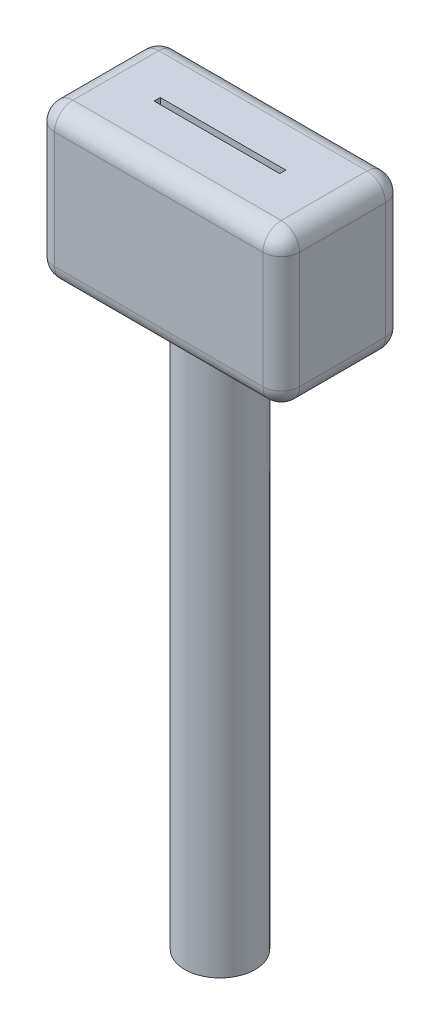
ISO-10303-21;
HEADER;
FILE_DESCRIPTION(('STEP AP214'),'2;1');
FILE_NAME('part.step','',(''),(''),'','','');
FILE_SCHEMA(('AUTOMOTIVE_DESIGN { 1 0 10303 214 1 1 1 1 }'));
ENDSEC;
DATA;
#1=APPLICATION_CONTEXT('core data for automotive mechanical design processes');
#2=APPLICATION_PROTOCOL_DEFINITION('international standard','automotive_design',2000,#1);
#3=PRODUCT_CONTEXT('',#1,'mechanical');
#4=PRODUCT('Part','Part','',(#3));
#5=PRODUCT_RELATED_PRODUCT_CATEGORY('part','',(#4));
#6=PRODUCT_DEFINITION_FORMATION('','',#4);
#7=PRODUCT_DEFINITION_CONTEXT('part definition',#1,'design');
#8=PRODUCT_DEFINITION('design','',#6,#7);
#9=PRODUCT_DEFINITION_SHAPE('','',#8);
#10=(LENGTH_UNIT() NAMED_UNIT(*) SI_UNIT(.MILLI.,.METRE.));
#11=(NAMED_UNIT(*) PLANE_ANGLE_UNIT() SI_UNIT($,.RADIAN.));
#12=(NAMED_UNIT(*) SI_UNIT($,.STERADIAN.) SOLID_ANGLE_UNIT());
#13=UNCERTAINTY_MEASURE_WITH_UNIT(LENGTH_MEASURE(1.E-05),#10,'distance_accuracy_value','');
#14=(GEOMETRIC_REPRESENTATION_CONTEXT(3) GLOBAL_UNCERTAINTY_ASSIGNED_CONTEXT((#13)) GLOBAL_UNIT_ASSIGNED_CONTEXT((#10,
#11,#12)) REPRESENTATION_CONTEXT('',''));
#15=CARTESIAN_POINT('',(0.,0.,0.));
#16=DIRECTION('',(0.,0.,1.));
#17=DIRECTION('',(1.,0.,0.));
#18=AXIS2_PLACEMENT_3D('',#15,#16,#17);
#19=CARTESIAN_POINT('',(0.,90.,0.));
#20=DIRECTION('',(0.,-1.,0.));
#21=DIRECTION('',(0.,0.,-1.));
#22=AXIS2_PLACEMENT_3D('',#19,#20,#21);
#23=CYLINDRICAL_SURFACE('',#22,5.75);
#24=CARTESIAN_POINT('',(0.,90.,0.));
#25=DIRECTION('',(0.,1.,0.));
#26=DIRECTION('',(0.,0.,1.));
#27=AXIS2_PLACEMENT_3D('',#24,#25,#26);
#28=CIRCLE('',#27,5.75);
#29=CARTESIAN_POINT('',(0.,90.,-5.75));
#30=VERTEX_POINT('',#29);
#31=EDGE_CURVE('E214',#30,#30,#28,.T.);
#32=CARTESIAN_POINT('',(0.,0.,0.));
#33=DIRECTION('',(0.,1.,0.));
#34=DIRECTION('',(0.,0.,1.));
#35=AXIS2_PLACEMENT_3D('',#32,#33,#34);
#36=CIRCLE('',#35,5.75);
#37=CARTESIAN_POINT('',(0.,0.,-5.75));
#38=VERTEX_POINT('',#37);
#39=EDGE_CURVE('E208',#38,#38,#36,.T.);
#40=CARTESIAN_POINT('',(0.,90.,-5.75));
#41=CARTESIAN_POINT('',(0.,89.0625,-5.75));
#42=CARTESIAN_POINT('',(0.,88.125,-5.75));
#43=CARTESIAN_POINT('',(0.,86.25,-5.75));
#44=CARTESIAN_POINT('',(0.,85.3125,-5.75));
#45=CARTESIAN_POINT('',(0.,83.4375,-5.75));
#46=CARTESIAN_POINT('',(0.,82.5,-5.75));
#47=CARTESIAN_POINT('',(0.,80.625,-5.75));
#48=CARTESIAN_POINT('',(0.,79.6875,-5.75));
#49=CARTESIAN_POINT('',(0.,77.8125,-5.75));
#50=CARTESIAN_POINT('',(0.,76.875,-5.75));
#51=CARTESIAN_POINT('',(0.,75.,-5.75));
#52=CARTESIAN_POINT('',(0.,74.0625,-5.75));
#53=CARTESIAN_POINT('',(0.,72.1875,-5.75));
#54=CARTESIAN_POINT('',(0.,71.25,-5.75));
#55=CARTESIAN_POINT('',(0.,69.375,-5.75));
#56=CARTESIAN_POINT('',(0.,68.4375,-5.75));
#57=CARTESIAN_POINT('',(0.,66.5625,-5.75));
#58=CARTESIAN_POINT('',(0.,65.625,-5.75));
#59=CARTESIAN_POINT('',(0.,63.75,-5.75));
#60=CARTESIAN_POINT('',(0.,62.8125,-5.75));
#61=CARTESIAN_POINT('',(0.,60.9375,-5.75));
#62=CARTESIAN_POINT('',(0.,60.,-5.75));
#63=CARTESIAN_POINT('',(0.,58.125,-5.75));
#64=CARTESIAN_POINT('',(0.,57.1875,-5.75));
#65=CARTESIAN_POINT('',(0.,55.3125,-5.75));
#66=CARTESIAN_POINT('',(0.,54.375,-5.75));
#67=CARTESIAN_POINT('',(0.,52.5,-5.75));
#68=CARTESIAN_POINT('',(0.,51.5625,-5.75));
#69=CARTESIAN_POINT('',(0.,49.6875,-5.75));
#70=CARTESIAN_POINT('',(0.,48.75,-5.75));
#71=CARTESIAN_POINT('',(0.,46.875,-5.75));
#72=CARTESIAN_POINT('',(0.,45.9375,-5.75));
#73=CARTESIAN_POINT('',(0.,44.0625,-5.75));
#74=CARTESIAN_POINT('',(0.,43.125,-5.75));
#75=CARTESIAN_POINT('',(0.,41.25,-5.75));
#76=CARTESIAN_POINT('',(0.,40.3125,-5.75));
#77=CARTESIAN_POINT('',(0.,38.4375,-5.75));
#78=CARTESIAN_POINT('',(0.,37.5,-5.75));
#79=CARTESIAN_POINT('',(0.,35.625,-5.75));
#80=CARTESIAN_POINT('',(0.,34.6875,-5.75));
#81=CARTESIAN_POINT('',(0.,32.8125,-5.75));
#82=CARTESIAN_POINT('',(0.,31.875,-5.75));
#83=CARTESIAN_POINT('',(0.,30.,-5.75));
#84=CARTESIAN_POINT('',(0.,29.0625,-5.75));
#85=CARTESIAN_POINT('',(0.,27.1875,-5.75));
#86=CARTESIAN_POINT('',(0.,26.25,-5.75));
#87=CARTESIAN_POINT('',(0.,24.375,-5.75));
#88=CARTESIAN_POINT('',(0.,23.4375,-5.75));
#89=CARTESIAN_POINT('',(0.,21.5625,-5.75));
#90=CARTESIAN_POINT('',(0.,20.625,-5.75));
#91=CARTESIAN_POINT('',(0.,18.75,-5.75));
#92=CARTESIAN_POINT('',(0.,17.8125,-5.75));
#93=CARTESIAN_POINT('',(0.,15.9375,-5.75));
#94=CARTESIAN_POINT('',(0.,15.,-5.75));
#95=CARTESIAN_POINT('',(0.,13.125,-5.75));
#96=CARTESIAN_POINT('',(0.,12.1875,-5.75));
#97=CARTESIAN_POINT('',(0.,10.3125,-5.75));
#98=CARTESIAN_POINT('',(0.,9.37499999999999,-5.75));
#99=CARTESIAN_POINT('',(0.,7.49999999999999,-5.75));
#100=CARTESIAN_POINT('',(0.,6.56249999999999,-5.75));
#101=CARTESIAN_POINT('',(0.,4.68749999999999,-5.75));
#102=CARTESIAN_POINT('',(0.,3.74999999999998,-5.75));
#103=CARTESIAN_POINT('',(0.,1.87499999999998,-5.75));
#104=CARTESIAN_POINT('',(0.,0.937499999999986,-5.75));
#105=CARTESIAN_POINT('',(0.,0.,-5.75));
#106=B_SPLINE_CURVE_WITH_KNOTS('',3,(#40,#41,#42,#43,#44,#45,#46,#47,#48,#49,#50,#51,#52,#53,
#54,#55,#56,#57,#58,#59,#60,#61,#62,#63,#64,#65,#66,#67,#68,#69,#70,#71,#72,#73,#74,#75,#76,#77,
#78,#79,#80,#81,#82,#83,#84,#85,#86,#87,#88,#89,#90,#91,#92,#93,#94,#95,#96,#97,#98,#99,#100,
#101,#102,#103,#104,#105),.UNSPECIFIED.,.F.,.F.,(4,2,2,2,2,2,2,2,2,2,2,2,2,2,2,2,2,2,2,2,2,2,2,
2,2,2,2,2,2,2,2,2,4),(0.,2.81250000000001,5.62500000000001,8.43750000000001,11.25,14.0625,
16.875,19.6875,22.5,25.3125,28.125,30.9375,33.75,36.5625,39.375,42.1875,45.,47.8125,50.625,
53.4375,56.25,59.0625,61.875,64.6875,67.5,70.3125,73.125,75.9375,78.75,81.5625,84.375,87.1875,
90.),.UNSPECIFIED.);
#107=EDGE_CURVE('BSEAM45',#30,#38,#106,.T.);
#108=ORIENTED_EDGE('',*,*,#31,.F.);
#109=ORIENTED_EDGE('',*,*,#39,.T.);
#110=ORIENTED_EDGE('',*,*,#107,.T.);
#111=ORIENTED_EDGE('',*,*,#107,.F.);
#112=EDGE_LOOP('',(#108,#110,#109,#111));
#113=FACE_BOUND('',#112,.T.);
#114=ADVANCED_FACE('F45',(#113),#23,.T.);
#115=CARTESIAN_POINT('',(0.,0.,0.));
#116=DIRECTION('',(0.,1.,0.));
#117=DIRECTION('',(0.,0.,1.));
#118=AXIS2_PLACEMENT_3D('',#115,#116,#117);
#119=PLANE('',#118);
#120=ORIENTED_EDGE('',*,*,#39,.F.);
#121=EDGE_LOOP('',(#120));
#122=FACE_BOUND('',#121,.T.);
#123=ADVANCED_FACE('F476',(#122),#119,.F.);
#124=CARTESIAN_POINT('',(20.,115.,10.));
#125=DIRECTION('',(-1.,0.,0.));
#126=DIRECTION('',(0.,0.,1.));
#127=AXIS2_PLACEMENT_3D('',#124,#125,#126);
#128=PLANE('',#127);
#129=DIRECTION('',(0.,0.,-1.));
#130=VECTOR('',#129,1.);
#131=CARTESIAN_POINT('',(20.,93.,-10.));
#132=LINE('',#131,#130);
#133=CARTESIAN_POINT('',(20.,93.,7.));
#134=VERTEX_POINT('',#133);
#135=CARTESIAN_POINT('',(20.,93.,-7.));
#136=VERTEX_POINT('',#135);
#137=EDGE_CURVE('E263',#134,#136,#132,.T.);
#138=ORIENTED_EDGE('',*,*,#137,.T.);
#139=DIRECTION('',(0.,-1.,0.));
#140=VECTOR('',#139,1.);
#141=CARTESIAN_POINT('',(20.,115.,-7.));
#142=LINE('',#141,#140);
#143=CARTESIAN_POINT('',(20.,112.,-7.));
#144=VERTEX_POINT('',#143);
#145=EDGE_CURVE('E270',#136,#144,#142,.F.);
#146=ORIENTED_EDGE('',*,*,#145,.T.);
#147=DIRECTION('',(0.,0.,-1.));
#148=VECTOR('',#147,1.);
#149=CARTESIAN_POINT('',(20.,112.,10.));
#150=LINE('',#149,#148);
#151=CARTESIAN_POINT('',(20.,112.,7.));
#152=VERTEX_POINT('',#151);
#153=EDGE_CURVE('E266',#144,#152,#150,.F.);
#154=ORIENTED_EDGE('',*,*,#153,.T.);
#155=DIRECTION('',(0.,-1.,0.));
#156=VECTOR('',#155,1.);
#157=CARTESIAN_POINT('',(20.,115.,7.));
#158=LINE('',#157,#156);
#159=EDGE_CURVE('E260',#152,#134,#158,.T.);
#160=ORIENTED_EDGE('',*,*,#159,.T.);
#161=EDGE_LOOP('',(#138,#146,#154,#160));
#162=FACE_BOUND('',#161,.T.);
#163=ADVANCED_FACE('F428',(#162),#128,.F.);
#164=CARTESIAN_POINT('',(-20.,115.,-10.));
#165=DIRECTION('',(0.,0.,1.));
#166=DIRECTION('',(1.,0.,0.));
#167=AXIS2_PLACEMENT_3D('',#164,#165,#166);
#168=PLANE('',#167);
#169=DIRECTION('',(-1.,0.,0.));
#170=VECTOR('',#169,1.);
#171=CARTESIAN_POINT('',(-20.,112.,-10.));
#172=LINE('',#171,#170);
#173=CARTESIAN_POINT('',(-17.,112.,-10.));
#174=VERTEX_POINT('',#173);
#175=CARTESIAN_POINT('',(17.,112.,-10.));
#176=VERTEX_POINT('',#175);
#177=EDGE_CURVE('E279',#174,#176,#172,.F.);
#178=ORIENTED_EDGE('',*,*,#177,.T.);
#179=DIRECTION('',(0.,-1.,0.));
#180=VECTOR('',#179,1.);
#181=CARTESIAN_POINT('',(17.,115.,-10.));
#182=LINE('',#181,#180);
#183=CARTESIAN_POINT('',(17.,93.,-10.));
#184=VERTEX_POINT('',#183);
#185=EDGE_CURVE('E282',#176,#184,#182,.T.);
#186=ORIENTED_EDGE('',*,*,#185,.T.);
#187=DIRECTION('',(-1.,0.,0.));
#188=VECTOR('',#187,1.);
#189=CARTESIAN_POINT('',(-20.,93.,-10.));
#190=LINE('',#189,#188);
#191=CARTESIAN_POINT('',(-17.,93.,-10.));
#192=VERTEX_POINT('',#191);
#193=EDGE_CURVE('E273',#184,#192,#190,.T.);
#194=ORIENTED_EDGE('',*,*,#193,.T.);
#195=DIRECTION('',(0.,-1.,0.));
#196=VECTOR('',#195,1.);
#197=CARTESIAN_POINT('',(-17.,115.,-10.));
#198=LINE('',#197,#196);
#199=EDGE_CURVE('E276',#192,#174,#198,.F.);
#200=ORIENTED_EDGE('',*,*,#199,.T.);
#201=EDGE_LOOP('',(#178,#186,#194,#200));
#202=FACE_BOUND('',#201,.T.);
#203=ADVANCED_FACE('F399',(#202),#168,.F.);
#204=CARTESIAN_POINT('',(-20.,115.,10.));
#205=DIRECTION('',(1.,0.,0.));
#206=DIRECTION('',(0.,0.,-1.));
#207=AXIS2_PLACEMENT_3D('',#204,#205,#206);
#208=PLANE('',#207);
#209=DIRECTION('',(0.,0.,1.));
#210=VECTOR('',#209,1.);
#211=CARTESIAN_POINT('',(-20.,112.,10.));
#212=LINE('',#211,#210);
#213=CARTESIAN_POINT('',(-20.,112.,7.));
#214=VERTEX_POINT('',#213);
#215=CARTESIAN_POINT('',(-20.,112.,-7.));
#216=VERTEX_POINT('',#215);
#217=EDGE_CURVE('E240',#214,#216,#212,.F.);
#218=ORIENTED_EDGE('',*,*,#217,.T.);
#219=DIRECTION('',(0.,-1.,0.));
#220=VECTOR('',#219,1.);
#221=CARTESIAN_POINT('',(-20.,115.,-7.));
#222=LINE('',#221,#220);
#223=CARTESIAN_POINT('',(-20.,93.,-7.));
#224=VERTEX_POINT('',#223);
#225=EDGE_CURVE('E244',#216,#224,#222,.T.);
#226=ORIENTED_EDGE('',*,*,#225,.T.);
#227=DIRECTION('',(0.,0.,1.));
#228=VECTOR('',#227,1.);
#229=CARTESIAN_POINT('',(-20.,93.,10.));
#230=LINE('',#229,#228);
#231=CARTESIAN_POINT('',(-20.,93.,7.));
#232=VERTEX_POINT('',#231);
#233=EDGE_CURVE('E237',#224,#232,#230,.T.);
#234=ORIENTED_EDGE('',*,*,#233,.T.);
#235=DIRECTION('',(0.,-1.,0.));
#236=VECTOR('',#235,1.);
#237=CARTESIAN_POINT('',(-20.,115.,7.));
#238=LINE('',#237,#236);
#239=EDGE_CURVE('E234',#232,#214,#238,.F.);
#240=ORIENTED_EDGE('',*,*,#239,.T.);
#241=EDGE_LOOP('',(#218,#226,#234,#240));
#242=FACE_BOUND('',#241,.T.);
#243=ADVANCED_FACE('F694',(#242),#208,.F.);
#244=CARTESIAN_POINT('',(-20.,115.,10.));
#245=DIRECTION('',(0.,0.,-1.));
#246=DIRECTION('',(-1.,0.,0.));
#247=AXIS2_PLACEMENT_3D('',#244,#245,#246);
#248=PLANE('',#247);
#249=DIRECTION('',(1.,0.,0.));
#250=VECTOR('',#249,1.);
#251=CARTESIAN_POINT('',(-20.,112.,10.));
#252=LINE('',#251,#250);
#253=CARTESIAN_POINT('',(17.,112.,10.));
#254=VERTEX_POINT('',#253);
#255=CARTESIAN_POINT('',(-17.,112.,10.));
#256=VERTEX_POINT('',#255);
#257=EDGE_CURVE('E55',#254,#256,#252,.F.);
#258=ORIENTED_EDGE('',*,*,#257,.T.);
#259=DIRECTION('',(0.,-1.,0.));
#260=VECTOR('',#259,1.);
#261=CARTESIAN_POINT('',(-17.,115.,10.));
#262=LINE('',#261,#260);
#263=CARTESIAN_POINT('',(-17.,93.,10.));
#264=VERTEX_POINT('',#263);
#265=EDGE_CURVE('E11',#256,#264,#262,.T.);
#266=ORIENTED_EDGE('',*,*,#265,.T.);
#267=DIRECTION('',(1.,0.,0.));
#268=VECTOR('',#267,1.);
#269=CARTESIAN_POINT('',(20.,93.,10.));
#270=LINE('',#269,#268);
#271=CARTESIAN_POINT('',(17.,93.,10.));
#272=VERTEX_POINT('',#271);
#273=EDGE_CURVE('E286',#264,#272,#270,.T.);
#274=ORIENTED_EDGE('',*,*,#273,.T.);
#275=DIRECTION('',(0.,-1.,0.));
#276=VECTOR('',#275,1.);
#277=CARTESIAN_POINT('',(17.,115.,10.));
#278=LINE('',#277,#276);
#279=EDGE_CURVE('E66',#272,#254,#278,.F.);
#280=ORIENTED_EDGE('',*,*,#279,.T.);
#281=EDGE_LOOP('',(#258,#266,#274,#280));
#282=FACE_BOUND('',#281,.T.);
#283=ADVANCED_FACE('F686',(#282),#248,.F.);
#284=CARTESIAN_POINT('',(0.,115.,0.));
#285=DIRECTION('',(0.,-1.,0.));
#286=DIRECTION('',(0.,0.,-1.));
#287=AXIS2_PLACEMENT_3D('',#284,#285,#286);
#288=PLANE('',#287);
#289=DIRECTION('',(0.,0.,-1.));
#290=VECTOR('',#289,1.);
#291=CARTESIAN_POINT('',(17.,115.,0.));
#292=LINE('',#291,#290);
#293=CARTESIAN_POINT('',(17.,115.,7.));
#294=VERTEX_POINT('',#293);
#295=CARTESIAN_POINT('',(17.,115.,-7.));
#296=VERTEX_POINT('',#295);
#297=EDGE_CURVE('E224',#294,#296,#292,.T.);
#298=ORIENTED_EDGE('',*,*,#297,.T.);
#299=DIRECTION('',(-1.,0.,0.));
#300=VECTOR('',#299,1.);
#301=CARTESIAN_POINT('',(0.,115.,-7.));
#302=LINE('',#301,#300);
#303=CARTESIAN_POINT('',(-17.,115.,-7.));
#304=VERTEX_POINT('',#303);
#305=EDGE_CURVE('E231',#296,#304,#302,.T.);
#306=ORIENTED_EDGE('',*,*,#305,.T.);
#307=DIRECTION('',(0.,0.,1.));
#308=VECTOR('',#307,1.);
#309=CARTESIAN_POINT('',(-17.,115.,0.));
#310=LINE('',#309,#308);
#311=CARTESIAN_POINT('',(-17.,115.,7.));
#312=VERTEX_POINT('',#311);
#313=EDGE_CURVE('E227',#304,#312,#310,.T.);
#314=ORIENTED_EDGE('',*,*,#313,.T.);
#315=DIRECTION('',(1.,0.,0.));
#316=VECTOR('',#315,1.);
#317=CARTESIAN_POINT('',(0.,115.,7.));
#318=LINE('',#317,#316);
#319=EDGE_CURVE('E218',#312,#294,#318,.T.);
#320=ORIENTED_EDGE('',*,*,#319,.T.);
#321=EDGE_LOOP('',(#298,#306,#314,#320));
#322=FACE_BOUND('',#321,.T.);
#323=DIRECTION('',(-1.,0.,0.));
#324=VECTOR('',#323,1.);
#325=CARTESIAN_POINT('',(-10.25,115.,-0.5));
#326=LINE('',#325,#324);
#327=CARTESIAN_POINT('',(10.25,115.,-0.5));
#328=VERTEX_POINT('',#327);
#329=CARTESIAN_POINT('',(-10.25,115.,-0.5));
#330=VERTEX_POINT('',#329);
#331=EDGE_CURVE('E199',#328,#330,#326,.T.);
#332=ORIENTED_EDGE('',*,*,#331,.F.);
#333=DIRECTION('',(0.,0.,-1.));
#334=VECTOR('',#333,1.);
#335=CARTESIAN_POINT('',(10.25,115.,0.5));
#336=LINE('',#335,#334);
#337=CARTESIAN_POINT('',(10.25,115.,0.5));
#338=VERTEX_POINT('',#337);
#339=EDGE_CURVE('E166',#338,#328,#336,.T.);
#340=ORIENTED_EDGE('',*,*,#339,.F.);
#341=DIRECTION('',(1.,0.,0.));
#342=VECTOR('',#341,1.);
#343=CARTESIAN_POINT('',(-10.25,115.,0.5));
#344=LINE('',#343,#342);
#345=CARTESIAN_POINT('',(-10.25,115.,0.5));
#346=VERTEX_POINT('',#345);
#347=EDGE_CURVE('E186',#346,#338,#344,.T.);
#348=ORIENTED_EDGE('',*,*,#347,.F.);
#349=DIRECTION('',(0.,0.,1.));
#350=VECTOR('',#349,1.);
#351=CARTESIAN_POINT('',(-10.25,115.,0.5));
#352=LINE('',#351,#350);
#353=EDGE_CURVE('E190',#330,#346,#352,.T.);
#354=ORIENTED_EDGE('',*,*,#353,.F.);
#355=EDGE_LOOP('',(#332,#340,#348,#354));
#356=FACE_BOUND('',#355,.T.);
#357=ADVANCED_FACE('F417',(#322,#356),#288,.F.);
#358=CARTESIAN_POINT('',(0.,90.,0.));
#359=DIRECTION('',(0.,-1.,0.));
#360=DIRECTION('',(0.,0.,-1.));
#361=AXIS2_PLACEMENT_3D('',#358,#359,#360);
#362=PLANE('',#361);
#363=DIRECTION('',(0.,0.,1.));
#364=VECTOR('',#363,1.);
#365=CARTESIAN_POINT('',(-17.,90.,-10.));
#366=LINE('',#365,#364);
#367=CARTESIAN_POINT('',(-17.,90.,7.));
#368=VERTEX_POINT('',#367);
#369=CARTESIAN_POINT('',(-17.,90.,-7.));
#370=VERTEX_POINT('',#369);
#371=EDGE_CURVE('E253',#368,#370,#366,.F.);
#372=ORIENTED_EDGE('',*,*,#371,.T.);
#373=DIRECTION('',(-1.,0.,0.));
#374=VECTOR('',#373,1.);
#375=CARTESIAN_POINT('',(20.,90.,-7.));
#376=LINE('',#375,#374);
#377=CARTESIAN_POINT('',(17.,90.,-7.));
#378=VERTEX_POINT('',#377);
#379=EDGE_CURVE('E257',#370,#378,#376,.F.);
#380=ORIENTED_EDGE('',*,*,#379,.T.);
#381=DIRECTION('',(0.,0.,-1.));
#382=VECTOR('',#381,1.);
#383=CARTESIAN_POINT('',(17.,90.,10.));
#384=LINE('',#383,#382);
#385=CARTESIAN_POINT('',(17.,90.,7.));
#386=VERTEX_POINT('',#385);
#387=EDGE_CURVE('E250',#378,#386,#384,.F.);
#388=ORIENTED_EDGE('',*,*,#387,.T.);
#389=DIRECTION('',(1.,0.,0.));
#390=VECTOR('',#389,1.);
#391=CARTESIAN_POINT('',(-20.,90.,7.));
#392=LINE('',#391,#390);
#393=EDGE_CURVE('E247',#386,#368,#392,.F.);
#394=ORIENTED_EDGE('',*,*,#393,.T.);
#395=EDGE_LOOP('',(#372,#380,#388,#394));
#396=FACE_BOUND('',#395,.T.);
#397=ORIENTED_EDGE('',*,*,#31,.T.);
#398=EDGE_LOOP('',(#397));
#399=FACE_BOUND('',#398,.T.);
#400=ADVANCED_FACE('F437',(#396,#399),#362,.T.);
#401=CARTESIAN_POINT('',(10.25,95.,0.5));
#402=DIRECTION('',(1.,0.,0.));
#403=DIRECTION('',(0.,0.,-1.));
#404=AXIS2_PLACEMENT_3D('',#401,#402,#403);
#405=PLANE('',#404);
#406=ORIENTED_EDGE('',*,*,#339,.T.);
#407=DIRECTION('',(0.,1.,0.));
#408=VECTOR('',#407,1.);
#409=CARTESIAN_POINT('',(10.25,95.,-0.5));
#410=LINE('',#409,#408);
#411=CARTESIAN_POINT('',(10.25,95.,-0.5));
#412=VERTEX_POINT('',#411);
#413=EDGE_CURVE('E159',#412,#328,#410,.T.);
#414=ORIENTED_EDGE('',*,*,#413,.F.);
#415=DIRECTION('',(0.,0.,-1.));
#416=VECTOR('',#415,1.);
#417=CARTESIAN_POINT('',(10.25,95.,0.5));
#418=LINE('',#417,#416);
#419=CARTESIAN_POINT('',(10.25,95.,0.5));
#420=VERTEX_POINT('',#419);
#421=EDGE_CURVE('E163',#420,#412,#418,.T.);
#422=ORIENTED_EDGE('',*,*,#421,.F.);
#423=DIRECTION('',(0.,1.,0.));
#424=VECTOR('',#423,1.);
#425=CARTESIAN_POINT('',(10.25,95.,0.5));
#426=LINE('',#425,#424);
#427=EDGE_CURVE('E205',#420,#338,#426,.T.);
#428=ORIENTED_EDGE('',*,*,#427,.T.);
#429=EDGE_LOOP('',(#406,#414,#422,#428));
#430=FACE_BOUND('',#429,.T.);
#431=ADVANCED_FACE('F161',(#430),#405,.F.);
#432=CARTESIAN_POINT('',(-10.25,95.,0.5));
#433=DIRECTION('',(0.,0.,1.));
#434=DIRECTION('',(1.,0.,0.));
#435=AXIS2_PLACEMENT_3D('',#432,#433,#434);
#436=PLANE('',#435);
#437=ORIENTED_EDGE('',*,*,#347,.T.);
#438=ORIENTED_EDGE('',*,*,#427,.F.);
#439=DIRECTION('',(1.,0.,0.));
#440=VECTOR('',#439,1.);
#441=CARTESIAN_POINT('',(-10.25,95.,0.5));
#442=LINE('',#441,#440);
#443=CARTESIAN_POINT('',(-10.25,95.,0.5));
#444=VERTEX_POINT('',#443);
#445=EDGE_CURVE('E172',#444,#420,#442,.T.);
#446=ORIENTED_EDGE('',*,*,#445,.F.);
#447=DIRECTION('',(0.,1.,0.));
#448=VECTOR('',#447,1.);
#449=CARTESIAN_POINT('',(-10.25,95.,0.5));
#450=LINE('',#449,#448);
#451=EDGE_CURVE('E209',#444,#346,#450,.T.);
#452=ORIENTED_EDGE('',*,*,#451,.T.);
#453=EDGE_LOOP('',(#437,#438,#446,#452));
#454=FACE_BOUND('',#453,.T.);
#455=ADVANCED_FACE('F655',(#454),#436,.F.);
#456=CARTESIAN_POINT('',(-10.25,95.,0.5));
#457=DIRECTION('',(-1.,0.,0.));
#458=DIRECTION('',(0.,0.,1.));
#459=AXIS2_PLACEMENT_3D('',#456,#457,#458);
#460=PLANE('',#459);
#461=ORIENTED_EDGE('',*,*,#353,.T.);
#462=ORIENTED_EDGE('',*,*,#451,.F.);
#463=DIRECTION('',(0.,0.,1.));
#464=VECTOR('',#463,1.);
#465=CARTESIAN_POINT('',(-10.25,95.,0.5));
#466=LINE('',#465,#464);
#467=CARTESIAN_POINT('',(-10.25,95.,-0.5));
#468=VERTEX_POINT('',#467);
#469=EDGE_CURVE('E181',#468,#444,#466,.T.);
#470=ORIENTED_EDGE('',*,*,#469,.F.);
#471=DIRECTION('',(0.,1.,0.));
#472=VECTOR('',#471,1.);
#473=CARTESIAN_POINT('',(-10.25,95.,-0.5));
#474=LINE('',#473,#472);
#475=EDGE_CURVE('E171',#468,#330,#474,.T.);
#476=ORIENTED_EDGE('',*,*,#475,.T.);
#477=EDGE_LOOP('',(#461,#462,#470,#476));
#478=FACE_BOUND('',#477,.T.);
#479=ADVANCED_FACE('F647',(#478),#460,.F.);
#480=CARTESIAN_POINT('',(-10.25,95.,-0.5));
#481=DIRECTION('',(0.,0.,-1.));
#482=DIRECTION('',(-1.,0.,0.));
#483=AXIS2_PLACEMENT_3D('',#480,#481,#482);
#484=PLANE('',#483);
#485=ORIENTED_EDGE('',*,*,#331,.T.);
#486=ORIENTED_EDGE('',*,*,#475,.F.);
#487=DIRECTION('',(-1.,0.,0.));
#488=VECTOR('',#487,1.);
#489=CARTESIAN_POINT('',(-10.25,95.,-0.5));
#490=LINE('',#489,#488);
#491=EDGE_CURVE('E175',#412,#468,#490,.T.);
#492=ORIENTED_EDGE('',*,*,#491,.F.);
#493=ORIENTED_EDGE('',*,*,#413,.T.);
#494=EDGE_LOOP('',(#485,#486,#492,#493));
#495=FACE_BOUND('',#494,.T.);
#496=ADVANCED_FACE('F176',(#495),#484,.F.);
#497=CARTESIAN_POINT('',(0.,95.,0.));
#498=DIRECTION('',(0.,-1.,0.));
#499=DIRECTION('',(0.,0.,-1.));
#500=AXIS2_PLACEMENT_3D('',#497,#498,#499);
#501=PLANE('',#500);
#502=ORIENTED_EDGE('',*,*,#421,.T.);
#503=ORIENTED_EDGE('',*,*,#491,.T.);
#504=ORIENTED_EDGE('',*,*,#469,.T.);
#505=ORIENTED_EDGE('',*,*,#445,.T.);
#506=EDGE_LOOP('',(#502,#503,#504,#505));
#507=FACE_BOUND('',#506,.T.);
#508=ADVANCED_FACE('F183',(#507),#501,.F.);
#509=CARTESIAN_POINT('',(17.,93.,10.));
#510=DIRECTION('',(0.,0.,1.));
#511=DIRECTION('',(1.,0.,0.));
#512=AXIS2_PLACEMENT_3D('',#509,#510,#511);
#513=CYLINDRICAL_SURFACE('',#512,3.);
#514=CARTESIAN_POINT('',(17.,93.,-7.));
#515=DIRECTION('',(0.,0.,-1.));
#516=DIRECTION('',(-1.,0.,0.));
#517=AXIS2_PLACEMENT_3D('',#514,#515,#516);
#518=CIRCLE('',#517,3.);
#519=EDGE_CURVE('E49',#136,#378,#518,.T.);
#520=ORIENTED_EDGE('',*,*,#519,.F.);
#521=ORIENTED_EDGE('',*,*,#137,.F.);
#522=CARTESIAN_POINT('',(17.,93.,7.));
#523=DIRECTION('',(0.,0.,1.));
#524=DIRECTION('',(1.,0.,0.));
#525=AXIS2_PLACEMENT_3D('',#522,#523,#524);
#526=CIRCLE('',#525,3.);
#527=EDGE_CURVE('E375',#386,#134,#526,.T.);
#528=ORIENTED_EDGE('',*,*,#527,.F.);
#529=ORIENTED_EDGE('',*,*,#387,.F.);
#530=EDGE_LOOP('',(#520,#521,#528,#529));
#531=FACE_BOUND('',#530,.T.);
#532=ADVANCED_FACE('F47',(#531),#513,.T.);
#533=CARTESIAN_POINT('',(17.,93.,-7.));
#534=DIRECTION('',(0.,-1.,0.));
#535=DIRECTION('',(0.,0.,-1.));
#536=AXIS2_PLACEMENT_3D('',#533,#534,#535);
#537=SPHERICAL_SURFACE('',#536,3.);
#538=CARTESIAN_POINT('',(17.,93.,-7.));
#539=DIRECTION('',(0.,-1.,0.));
#540=DIRECTION('',(0.,0.,-1.));
#541=AXIS2_PLACEMENT_3D('',#538,#539,#540);
#542=CIRCLE('',#541,3.);
#543=EDGE_CURVE('E368',#136,#184,#542,.F.);
#544=ORIENTED_EDGE('',*,*,#543,.F.);
#545=ORIENTED_EDGE('',*,*,#519,.T.);
#546=CARTESIAN_POINT('',(17.,93.,-7.));
#547=DIRECTION('',(1.,0.,0.));
#548=DIRECTION('',(0.,0.,-1.));
#549=AXIS2_PLACEMENT_3D('',#546,#547,#548);
#550=CIRCLE('',#549,3.);
#551=EDGE_CURVE('E372',#184,#378,#550,.F.);
#552=ORIENTED_EDGE('',*,*,#551,.F.);
#553=EDGE_LOOP('',(#544,#545,#552));
#554=FACE_BOUND('',#553,.T.);
#555=ADVANCED_FACE('F388',(#554),#537,.T.);
#556=CARTESIAN_POINT('',(17.,93.,7.));
#557=DIRECTION('',(1.,0.,0.));
#558=DIRECTION('',(0.,0.,-1.));
#559=AXIS2_PLACEMENT_3D('',#556,#557,#558);
#560=SPHERICAL_SURFACE('',#559,3.);
#561=CARTESIAN_POINT('',(17.,93.,7.));
#562=DIRECTION('',(1.,0.,0.));
#563=DIRECTION('',(0.,0.,-1.));
#564=AXIS2_PLACEMENT_3D('',#561,#562,#563);
#565=CIRCLE('',#564,3.);
#566=EDGE_CURVE('E360',#386,#272,#565,.F.);
#567=ORIENTED_EDGE('',*,*,#566,.F.);
#568=ORIENTED_EDGE('',*,*,#527,.T.);
#569=CARTESIAN_POINT('',(17.,93.,7.));
#570=DIRECTION('',(0.,-1.,0.));
#571=DIRECTION('',(0.,0.,-1.));
#572=AXIS2_PLACEMENT_3D('',#569,#570,#571);
#573=CIRCLE('',#572,3.);
#574=EDGE_CURVE('E364',#272,#134,#573,.F.);
#575=ORIENTED_EDGE('',*,*,#574,.F.);
#576=EDGE_LOOP('',(#567,#568,#575));
#577=FACE_BOUND('',#576,.T.);
#578=ADVANCED_FACE('F430',(#577),#560,.T.);
#579=CARTESIAN_POINT('',(-20.,93.,-7.));
#580=DIRECTION('',(1.,0.,0.));
#581=DIRECTION('',(0.,0.,-1.));
#582=AXIS2_PLACEMENT_3D('',#579,#580,#581);
#583=CYLINDRICAL_SURFACE('',#582,3.);
#584=ORIENTED_EDGE('',*,*,#551,.T.);
#585=ORIENTED_EDGE('',*,*,#379,.F.);
#586=CARTESIAN_POINT('',(-17.,93.,-7.));
#587=DIRECTION('',(-1.,0.,0.));
#588=DIRECTION('',(0.,0.,1.));
#589=AXIS2_PLACEMENT_3D('',#586,#587,#588);
#590=CIRCLE('',#589,3.);
#591=EDGE_CURVE('E353',#192,#370,#590,.T.);
#592=ORIENTED_EDGE('',*,*,#591,.F.);
#593=ORIENTED_EDGE('',*,*,#193,.F.);
#594=EDGE_LOOP('',(#584,#585,#592,#593));
#595=FACE_BOUND('',#594,.T.);
#596=ADVANCED_FACE('F395',(#595),#583,.T.);
#597=CARTESIAN_POINT('',(17.,115.,-7.));
#598=DIRECTION('',(0.,-1.,0.));
#599=DIRECTION('',(0.,0.,-1.));
#600=AXIS2_PLACEMENT_3D('',#597,#598,#599);
#601=CYLINDRICAL_SURFACE('',#600,3.);
#602=ORIENTED_EDGE('',*,*,#543,.T.);
#603=ORIENTED_EDGE('',*,*,#185,.F.);
#604=CARTESIAN_POINT('',(17.,112.,-7.));
#605=DIRECTION('',(0.,1.,0.));
#606=DIRECTION('',(0.,0.,1.));
#607=AXIS2_PLACEMENT_3D('',#604,#605,#606);
#608=CIRCLE('',#607,3.);
#609=EDGE_CURVE('E349',#144,#176,#608,.T.);
#610=ORIENTED_EDGE('',*,*,#609,.F.);
#611=ORIENTED_EDGE('',*,*,#145,.F.);
#612=EDGE_LOOP('',(#602,#603,#610,#611));
#613=FACE_BOUND('',#612,.T.);
#614=ADVANCED_FACE('F405',(#613),#601,.T.);
#615=CARTESIAN_POINT('',(17.,112.,0.));
#616=DIRECTION('',(0.,0.,-1.));
#617=DIRECTION('',(-1.,0.,0.));
#618=AXIS2_PLACEMENT_3D('',#615,#616,#617);
#619=CYLINDRICAL_SURFACE('',#618,3.);
#620=CARTESIAN_POINT('',(17.,112.,7.));
#621=DIRECTION('',(0.,0.,1.));
#622=DIRECTION('',(1.,0.,0.));
#623=AXIS2_PLACEMENT_3D('',#620,#621,#622);
#624=CIRCLE('',#623,3.);
#625=EDGE_CURVE('E341',#152,#294,#624,.T.);
#626=ORIENTED_EDGE('',*,*,#625,.F.);
#627=ORIENTED_EDGE('',*,*,#153,.F.);
#628=CARTESIAN_POINT('',(17.,112.,-7.));
#629=DIRECTION('',(0.,0.,-1.));
#630=DIRECTION('',(-1.,0.,0.));
#631=AXIS2_PLACEMENT_3D('',#628,#629,#630);
#632=CIRCLE('',#631,3.);
#633=EDGE_CURVE('E345',#296,#144,#632,.T.);
#634=ORIENTED_EDGE('',*,*,#633,.F.);
#635=ORIENTED_EDGE('',*,*,#297,.F.);
#636=EDGE_LOOP('',(#626,#627,#634,#635));
#637=FACE_BOUND('',#636,.T.);
#638=ADVANCED_FACE('F425',(#637),#619,.T.);
#639=CARTESIAN_POINT('',(17.,115.,7.));
#640=DIRECTION('',(0.,-1.,0.));
#641=DIRECTION('',(0.,0.,-1.));
#642=AXIS2_PLACEMENT_3D('',#639,#640,#641);
#643=CYLINDRICAL_SURFACE('',#642,3.);
#644=ORIENTED_EDGE('',*,*,#574,.T.);
#645=ORIENTED_EDGE('',*,*,#159,.F.);
#646=CARTESIAN_POINT('',(17.,112.,7.));
#647=DIRECTION('',(0.,1.,0.));
#648=DIRECTION('',(0.,0.,1.));
#649=AXIS2_PLACEMENT_3D('',#646,#647,#648);
#650=CIRCLE('',#649,3.);
#651=EDGE_CURVE('E338',#254,#152,#650,.T.);
#652=ORIENTED_EDGE('',*,*,#651,.F.);
#653=ORIENTED_EDGE('',*,*,#279,.F.);
#654=EDGE_LOOP('',(#644,#645,#652,#653));
#655=FACE_BOUND('',#654,.T.);
#656=ADVANCED_FACE('F466',(#655),#643,.T.);
#657=CARTESIAN_POINT('',(-20.,93.,7.));
#658=DIRECTION('',(-1.,0.,0.));
#659=DIRECTION('',(0.,0.,1.));
#660=AXIS2_PLACEMENT_3D('',#657,#658,#659);
#661=CYLINDRICAL_SURFACE('',#660,3.);
#662=ORIENTED_EDGE('',*,*,#566,.T.);
#663=ORIENTED_EDGE('',*,*,#273,.F.);
#664=CARTESIAN_POINT('',(-17.,93.,7.));
#665=DIRECTION('',(-1.,0.,0.));
#666=DIRECTION('',(0.,0.,1.));
#667=AXIS2_PLACEMENT_3D('',#664,#665,#666);
#668=CIRCLE('',#667,3.);
#669=EDGE_CURVE('E334',#368,#264,#668,.T.);
#670=ORIENTED_EDGE('',*,*,#669,.F.);
#671=ORIENTED_EDGE('',*,*,#393,.F.);
#672=EDGE_LOOP('',(#662,#663,#670,#671));
#673=FACE_BOUND('',#672,.T.);
#674=ADVANCED_FACE('F434',(#673),#661,.T.);
#675=CARTESIAN_POINT('',(-17.,93.,10.));
#676=DIRECTION('',(0.,0.,-1.));
#677=DIRECTION('',(-1.,0.,0.));
#678=AXIS2_PLACEMENT_3D('',#675,#676,#677);
#679=CYLINDRICAL_SURFACE('',#678,3.);
#680=CARTESIAN_POINT('',(-17.,93.,-7.));
#681=DIRECTION('',(0.,0.,-1.));
#682=DIRECTION('',(-1.,0.,0.));
#683=AXIS2_PLACEMENT_3D('',#680,#681,#682);
#684=CIRCLE('',#683,3.);
#685=EDGE_CURVE('E356',#370,#224,#684,.T.);
#686=ORIENTED_EDGE('',*,*,#685,.F.);
#687=ORIENTED_EDGE('',*,*,#371,.F.);
#688=CARTESIAN_POINT('',(-17.,93.,7.));
#689=DIRECTION('',(0.,0.,1.));
#690=DIRECTION('',(1.,0.,0.));
#691=AXIS2_PLACEMENT_3D('',#688,#689,#690);
#692=CIRCLE('',#691,3.);
#693=EDGE_CURVE('E330',#232,#368,#692,.T.);
#694=ORIENTED_EDGE('',*,*,#693,.F.);
#695=ORIENTED_EDGE('',*,*,#233,.F.);
#696=EDGE_LOOP('',(#686,#687,#694,#695));
#697=FACE_BOUND('',#696,.T.);
#698=ADVANCED_FACE('F442',(#697),#679,.T.);
#699=CARTESIAN_POINT('',(-17.,93.,-7.));
#700=DIRECTION('',(0.,-1.,0.));
#701=DIRECTION('',(0.,0.,-1.));
#702=AXIS2_PLACEMENT_3D('',#699,#700,#701);
#703=SPHERICAL_SURFACE('',#702,3.);
#704=ORIENTED_EDGE('',*,*,#591,.T.);
#705=ORIENTED_EDGE('',*,*,#685,.T.);
#706=CARTESIAN_POINT('',(-17.,93.,-7.));
#707=DIRECTION('',(0.,-1.,0.));
#708=DIRECTION('',(0.,0.,-1.));
#709=AXIS2_PLACEMENT_3D('',#706,#707,#708);
#710=CIRCLE('',#709,3.);
#711=EDGE_CURVE('E326',#192,#224,#710,.F.);
#712=ORIENTED_EDGE('',*,*,#711,.F.);
#713=EDGE_LOOP('',(#704,#705,#712));
#714=FACE_BOUND('',#713,.T.);
#715=ADVANCED_FACE('F446',(#714),#703,.T.);
#716=CARTESIAN_POINT('',(17.,112.,-7.));
#717=DIRECTION('',(1.,0.,0.));
#718=DIRECTION('',(0.,0.,-1.));
#719=AXIS2_PLACEMENT_3D('',#716,#717,#718);
#720=SPHERICAL_SURFACE('',#719,3.);
#721=ORIENTED_EDGE('',*,*,#633,.T.);
#722=ORIENTED_EDGE('',*,*,#609,.T.);
#723=CARTESIAN_POINT('',(17.,112.,-7.));
#724=DIRECTION('',(1.,0.,0.));
#725=DIRECTION('',(0.,1.,0.));
#726=AXIS2_PLACEMENT_3D('',#723,#724,#725);
#727=CIRCLE('',#726,3.);
#728=EDGE_CURVE('E322',#296,#176,#727,.F.);
#729=ORIENTED_EDGE('',*,*,#728,.F.);
#730=EDGE_LOOP('',(#721,#722,#729));
#731=FACE_BOUND('',#730,.T.);
#732=ADVANCED_FACE('F408',(#731),#720,.T.);
#733=CARTESIAN_POINT('',(17.,112.,7.));
#734=DIRECTION('',(1.,0.,0.));
#735=DIRECTION('',(0.,0.,-1.));
#736=AXIS2_PLACEMENT_3D('',#733,#734,#735);
#737=SPHERICAL_SURFACE('',#736,3.);
#738=ORIENTED_EDGE('',*,*,#651,.T.);
#739=ORIENTED_EDGE('',*,*,#625,.T.);
#740=CARTESIAN_POINT('',(17.,112.,7.));
#741=DIRECTION('',(1.,0.,0.));
#742=DIRECTION('',(0.,0.,-1.));
#743=AXIS2_PLACEMENT_3D('',#740,#741,#742);
#744=CIRCLE('',#743,3.);
#745=EDGE_CURVE('E318',#254,#294,#744,.F.);
#746=ORIENTED_EDGE('',*,*,#745,.F.);
#747=EDGE_LOOP('',(#738,#739,#746));
#748=FACE_BOUND('',#747,.T.);
#749=ADVANCED_FACE('F464',(#748),#737,.T.);
#750=CARTESIAN_POINT('',(-17.,93.,7.));
#751=DIRECTION('',(0.,-1.,0.));
#752=DIRECTION('',(0.,0.,-1.));
#753=AXIS2_PLACEMENT_3D('',#750,#751,#752);
#754=SPHERICAL_SURFACE('',#753,3.);
#755=ORIENTED_EDGE('',*,*,#693,.T.);
#756=ORIENTED_EDGE('',*,*,#669,.T.);
#757=CARTESIAN_POINT('',(-17.,93.,7.));
#758=DIRECTION('',(0.,-1.,0.));
#759=DIRECTION('',(0.,0.,-1.));
#760=AXIS2_PLACEMENT_3D('',#757,#758,#759);
#761=CIRCLE('',#760,3.);
#762=EDGE_CURVE('E315',#232,#264,#761,.F.);
#763=ORIENTED_EDGE('',*,*,#762,.F.);
#764=EDGE_LOOP('',(#755,#756,#763));
#765=FACE_BOUND('',#764,.T.);
#766=ADVANCED_FACE('F504',(#765),#754,.T.);
#767=CARTESIAN_POINT('',(-17.,115.,-7.));
#768=DIRECTION('',(0.,-1.,0.));
#769=DIRECTION('',(0.,0.,-1.));
#770=AXIS2_PLACEMENT_3D('',#767,#768,#769);
#771=CYLINDRICAL_SURFACE('',#770,3.);
#772=ORIENTED_EDGE('',*,*,#711,.T.);
#773=ORIENTED_EDGE('',*,*,#225,.F.);
#774=CARTESIAN_POINT('',(-17.,112.,-7.));
#775=DIRECTION('',(0.,1.,0.));
#776=DIRECTION('',(0.,0.,1.));
#777=AXIS2_PLACEMENT_3D('',#774,#775,#776);
#778=CIRCLE('',#777,3.);
#779=EDGE_CURVE('E311',#174,#216,#778,.T.);
#780=ORIENTED_EDGE('',*,*,#779,.F.);
#781=ORIENTED_EDGE('',*,*,#199,.F.);
#782=EDGE_LOOP('',(#772,#773,#780,#781));
#783=FACE_BOUND('',#782,.T.);
#784=ADVANCED_FACE('F449',(#783),#771,.T.);
#785=CARTESIAN_POINT('',(0.,112.,-7.));
#786=DIRECTION('',(-1.,0.,0.));
#787=DIRECTION('',(0.,0.,1.));
#788=AXIS2_PLACEMENT_3D('',#785,#786,#787);
#789=CYLINDRICAL_SURFACE('',#788,3.);
#790=ORIENTED_EDGE('',*,*,#728,.T.);
#791=ORIENTED_EDGE('',*,*,#177,.F.);
#792=CARTESIAN_POINT('',(-17.,112.,-7.));
#793=DIRECTION('',(-1.,0.,0.));
#794=DIRECTION('',(0.,0.,1.));
#795=AXIS2_PLACEMENT_3D('',#792,#793,#794);
#796=CIRCLE('',#795,3.);
#797=EDGE_CURVE('E307',#304,#174,#796,.T.);
#798=ORIENTED_EDGE('',*,*,#797,.F.);
#799=ORIENTED_EDGE('',*,*,#305,.F.);
#800=EDGE_LOOP('',(#790,#791,#798,#799));
#801=FACE_BOUND('',#800,.T.);
#802=ADVANCED_FACE('F412',(#801),#789,.T.);
#803=CARTESIAN_POINT('',(0.,112.,7.));
#804=DIRECTION('',(1.,0.,0.));
#805=DIRECTION('',(0.,0.,-1.));
#806=AXIS2_PLACEMENT_3D('',#803,#804,#805);
#807=CYLINDRICAL_SURFACE('',#806,3.);
#808=ORIENTED_EDGE('',*,*,#745,.T.);
#809=ORIENTED_EDGE('',*,*,#319,.F.);
#810=CARTESIAN_POINT('',(-17.,112.,7.));
#811=DIRECTION('',(-1.,0.,0.));
#812=DIRECTION('',(0.,0.,1.));
#813=AXIS2_PLACEMENT_3D('',#810,#811,#812);
#814=CIRCLE('',#813,3.);
#815=EDGE_CURVE('E303',#256,#312,#814,.T.);
#816=ORIENTED_EDGE('',*,*,#815,.F.);
#817=ORIENTED_EDGE('',*,*,#257,.F.);
#818=EDGE_LOOP('',(#808,#809,#816,#817));
#819=FACE_BOUND('',#818,.T.);
#820=ADVANCED_FACE('F461',(#819),#807,.T.);
#821=CARTESIAN_POINT('',(-17.,115.,7.));
#822=DIRECTION('',(0.,-1.,0.));
#823=DIRECTION('',(0.,0.,-1.));
#824=AXIS2_PLACEMENT_3D('',#821,#822,#823);
#825=CYLINDRICAL_SURFACE('',#824,3.);
#826=ORIENTED_EDGE('',*,*,#762,.T.);
#827=ORIENTED_EDGE('',*,*,#265,.F.);
#828=CARTESIAN_POINT('',(-17.,112.,7.));
#829=DIRECTION('',(0.,1.,0.));
#830=DIRECTION('',(0.,0.,1.));
#831=AXIS2_PLACEMENT_3D('',#828,#829,#830);
#832=CIRCLE('',#831,3.);
#833=EDGE_CURVE('E299',#214,#256,#832,.T.);
#834=ORIENTED_EDGE('',*,*,#833,.F.);
#835=ORIENTED_EDGE('',*,*,#239,.F.);
#836=EDGE_LOOP('',(#826,#827,#834,#835));
#837=FACE_BOUND('',#836,.T.);
#838=ADVANCED_FACE('F494',(#837),#825,.T.);
#839=CARTESIAN_POINT('',(-17.,112.,-7.));
#840=DIRECTION('',(0.,0.,-1.));
#841=DIRECTION('',(-1.,0.,0.));
#842=AXIS2_PLACEMENT_3D('',#839,#840,#841);
#843=SPHERICAL_SURFACE('',#842,3.);
#844=ORIENTED_EDGE('',*,*,#797,.T.);
#845=ORIENTED_EDGE('',*,*,#779,.T.);
#846=CARTESIAN_POINT('',(-17.,112.,-7.));
#847=DIRECTION('',(0.,0.,-1.));
#848=DIRECTION('',(0.,1.,0.));
#849=AXIS2_PLACEMENT_3D('',#846,#847,#848);
#850=CIRCLE('',#849,3.);
#851=EDGE_CURVE('E296',#304,#216,#850,.F.);
#852=ORIENTED_EDGE('',*,*,#851,.F.);
#853=EDGE_LOOP('',(#844,#845,#852));
#854=FACE_BOUND('',#853,.T.);
#855=ADVANCED_FACE('F451',(#854),#843,.T.);
#856=CARTESIAN_POINT('',(-17.,112.,7.));
#857=DIRECTION('',(0.,0.,1.));
#858=DIRECTION('',(1.,0.,0.));
#859=AXIS2_PLACEMENT_3D('',#856,#857,#858);
#860=SPHERICAL_SURFACE('',#859,3.);
#861=ORIENTED_EDGE('',*,*,#833,.T.);
#862=ORIENTED_EDGE('',*,*,#815,.T.);
#863=CARTESIAN_POINT('',(-17.,112.,7.));
#864=DIRECTION('',(0.,0.,1.));
#865=DIRECTION('',(1.,0.,0.));
#866=AXIS2_PLACEMENT_3D('',#863,#864,#865);
#867=CIRCLE('',#866,3.);
#868=EDGE_CURVE('E293',#214,#312,#867,.F.);
#869=ORIENTED_EDGE('',*,*,#868,.F.);
#870=EDGE_LOOP('',(#861,#862,#869));
#871=FACE_BOUND('',#870,.T.);
#872=ADVANCED_FACE('F458',(#871),#860,.T.);
#873=CARTESIAN_POINT('',(-17.,112.,0.));
#874=DIRECTION('',(0.,0.,1.));
#875=DIRECTION('',(1.,0.,0.));
#876=AXIS2_PLACEMENT_3D('',#873,#874,#875);
#877=CYLINDRICAL_SURFACE('',#876,3.);
#878=ORIENTED_EDGE('',*,*,#851,.T.);
#879=ORIENTED_EDGE('',*,*,#217,.F.);
#880=ORIENTED_EDGE('',*,*,#868,.T.);
#881=ORIENTED_EDGE('',*,*,#313,.F.);
#882=EDGE_LOOP('',(#878,#879,#880,#881));
#883=FACE_BOUND('',#882,.T.);
#884=ADVANCED_FACE('F454',(#883),#877,.T.);
#885=CLOSED_SHELL('',(#114,#123,#163,#203,#243,#283,#357,#400,#431,#455,#479,#496,#508,#532,
#555,#578,#596,#614,#638,#656,#674,#698,#715,#732,#749,#766,#784,#802,#820,#838,#855,#872,#884));
#886=MANIFOLD_SOLID_BREP('B2',#885);
#887=ADVANCED_BREP_SHAPE_REPRESENTATION('',(#18,#886),#14);
#888=SHAPE_DEFINITION_REPRESENTATION(#9,#887);
ENDSEC;
END-ISO-10303-21;
